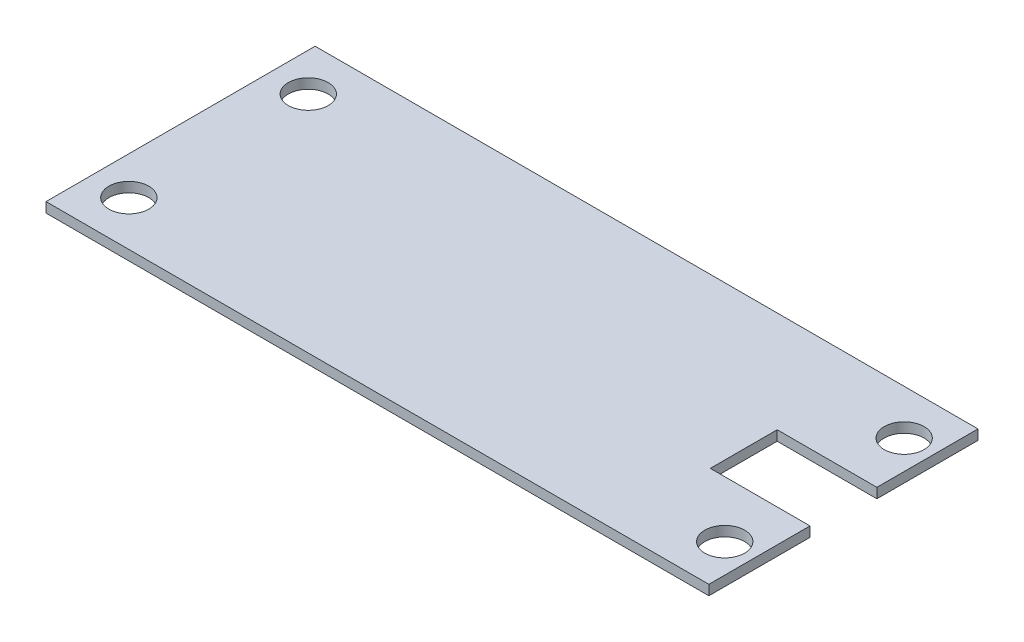
ISO-10303-21;
HEADER;
FILE_DESCRIPTION(('STEP AP214'),'2;1');
FILE_NAME('part.step','',(''),(''),'','','');
FILE_SCHEMA(('AUTOMOTIVE_DESIGN { 1 0 10303 214 1 1 1 1 }'));
ENDSEC;
DATA;
#1=APPLICATION_CONTEXT('core data for automotive mechanical design processes');
#2=APPLICATION_PROTOCOL_DEFINITION('international standard','automotive_design',2000,#1);
#3=PRODUCT_CONTEXT('',#1,'mechanical');
#4=PRODUCT('Part','Part','',(#3));
#5=PRODUCT_RELATED_PRODUCT_CATEGORY('part','',(#4));
#6=PRODUCT_DEFINITION_FORMATION('','',#4);
#7=PRODUCT_DEFINITION_CONTEXT('part definition',#1,'design');
#8=PRODUCT_DEFINITION('design','',#6,#7);
#9=PRODUCT_DEFINITION_SHAPE('','',#8);
#10=(LENGTH_UNIT() NAMED_UNIT(*) SI_UNIT(.MILLI.,.METRE.));
#11=(NAMED_UNIT(*) PLANE_ANGLE_UNIT() SI_UNIT($,.RADIAN.));
#12=(NAMED_UNIT(*) SI_UNIT($,.STERADIAN.) SOLID_ANGLE_UNIT());
#13=UNCERTAINTY_MEASURE_WITH_UNIT(LENGTH_MEASURE(1.E-05),#10,'distance_accuracy_value','');
#14=(GEOMETRIC_REPRESENTATION_CONTEXT(3) GLOBAL_UNCERTAINTY_ASSIGNED_CONTEXT((#13)) GLOBAL_UNIT_ASSIGNED_CONTEXT((#10,
#11,#12)) REPRESENTATION_CONTEXT('',''));
#15=CARTESIAN_POINT('',(0.,0.,0.));
#16=DIRECTION('',(0.,0.,1.));
#17=DIRECTION('',(1.,0.,0.));
#18=AXIS2_PLACEMENT_3D('',#15,#16,#17);
#19=CARTESIAN_POINT('',(66.5,1.,0.));
#20=DIRECTION('',(-1.,0.,0.));
#21=DIRECTION('',(0.,0.,1.));
#22=AXIS2_PLACEMENT_3D('',#19,#20,#21);
#23=PLANE('',#22);
#24=DIRECTION('',(0.,-1.,0.));
#25=VECTOR('',#24,1.);
#26=CARTESIAN_POINT('',(66.5,0.,-16.8538903517755));
#27=LINE('',#26,#25);
#28=CARTESIAN_POINT('',(66.5,1.,-16.8538903517755));
#29=VERTEX_POINT('',#28);
#30=CARTESIAN_POINT('',(66.5,0.,-16.8538903517755));
#31=VERTEX_POINT('',#30);
#32=EDGE_CURVE('E130',#29,#31,#27,.T.);
#33=ORIENTED_EDGE('',*,*,#32,.T.);
#34=DIRECTION('',(0.,0.,-1.));
#35=VECTOR('',#34,1.);
#36=CARTESIAN_POINT('',(66.5,0.,0.));
#37=LINE('',#36,#35);
#38=CARTESIAN_POINT('',(66.5,0.,-27.));
#39=VERTEX_POINT('',#38);
#40=EDGE_CURVE('E107',#31,#39,#37,.T.);
#41=ORIENTED_EDGE('',*,*,#40,.T.);
#42=DIRECTION('',(0.,-1.,0.));
#43=VECTOR('',#42,1.);
#44=CARTESIAN_POINT('',(66.5,1.,-27.));
#45=LINE('',#44,#43);
#46=CARTESIAN_POINT('',(66.5,1.,-27.));
#47=VERTEX_POINT('',#46);
#48=EDGE_CURVE('E159',#47,#39,#45,.T.);
#49=ORIENTED_EDGE('',*,*,#48,.F.);
#50=DIRECTION('',(0.,0.,-1.));
#51=VECTOR('',#50,1.);
#52=CARTESIAN_POINT('',(66.5,1.,0.));
#53=LINE('',#52,#51);
#54=EDGE_CURVE('E143',#29,#47,#53,.T.);
#55=ORIENTED_EDGE('',*,*,#54,.F.);
#56=EDGE_LOOP('',(#33,#41,#49,#55));
#57=FACE_BOUND('',#56,.T.);
#58=ADVANCED_FACE('F36',(#57),#23,.F.);
#59=DIRECTION('',(0.,1.,0.));
#60=VECTOR('',#59,1.);
#61=CARTESIAN_POINT('',(66.5,0.,-10.1461096482245));
#62=LINE('',#61,#60);
#63=CARTESIAN_POINT('',(66.5,0.,-10.1461096482245));
#64=VERTEX_POINT('',#63);
#65=CARTESIAN_POINT('',(66.5,1.,-10.1461096482245));
#66=VERTEX_POINT('',#65);
#67=EDGE_CURVE('E126',#64,#66,#62,.T.);
#68=ORIENTED_EDGE('',*,*,#67,.T.);
#69=CARTESIAN_POINT('',(66.5,1.,0.));
#70=VERTEX_POINT('',#69);
#71=EDGE_CURVE('E144',#70,#66,#53,.T.);
#72=ORIENTED_EDGE('',*,*,#71,.F.);
#73=DIRECTION('',(0.,-1.,0.));
#74=VECTOR('',#73,1.);
#75=CARTESIAN_POINT('',(66.5,1.,0.));
#76=LINE('',#75,#74);
#77=CARTESIAN_POINT('',(66.5,0.,0.));
#78=VERTEX_POINT('',#77);
#79=EDGE_CURVE('E44',#70,#78,#76,.T.);
#80=ORIENTED_EDGE('',*,*,#79,.T.);
#81=EDGE_CURVE('E153',#78,#64,#37,.T.);
#82=ORIENTED_EDGE('',*,*,#81,.T.);
#83=EDGE_LOOP('',(#68,#72,#80,#82));
#84=FACE_BOUND('',#83,.T.);
#85=ADVANCED_FACE('F166',(#84),#23,.F.);
#86=CARTESIAN_POINT('',(0.,1.,0.));
#87=DIRECTION('',(0.,-1.,0.));
#88=DIRECTION('',(0.,0.,-1.));
#89=AXIS2_PLACEMENT_3D('',#86,#87,#88);
#90=PLANE('',#89);
#91=CARTESIAN_POINT('',(3.81277709558755,1.,-4.5));
#92=DIRECTION('',(0.,1.,0.));
#93=DIRECTION('',(0.,0.,1.));
#94=AXIS2_PLACEMENT_3D('',#91,#92,#93);
#95=CIRCLE('',#94,2.);
#96=CARTESIAN_POINT('',(3.81277709558755,1.,-2.5));
#97=VERTEX_POINT('',#96);
#98=EDGE_CURVE('E250',#97,#97,#95,.T.);
#99=ORIENTED_EDGE('',*,*,#98,.F.);
#100=EDGE_LOOP('',(#99));
#101=FACE_BOUND('',#100,.T.);
#102=CARTESIAN_POINT('',(3.81277709558755,1.,-22.5));
#103=DIRECTION('',(0.,1.,0.));
#104=DIRECTION('',(0.,0.,1.));
#105=AXIS2_PLACEMENT_3D('',#102,#103,#104);
#106=CIRCLE('',#105,2.);
#107=CARTESIAN_POINT('',(3.81277709558755,1.,-20.5));
#108=VERTEX_POINT('',#107);
#109=EDGE_CURVE('E243',#108,#108,#106,.T.);
#110=ORIENTED_EDGE('',*,*,#109,.F.);
#111=EDGE_LOOP('',(#110));
#112=FACE_BOUND('',#111,.T.);
#113=CARTESIAN_POINT('',(63.5912451049318,1.,-22.5));
#114=DIRECTION('',(0.,1.,0.));
#115=DIRECTION('',(0.,0.,1.));
#116=AXIS2_PLACEMENT_3D('',#113,#114,#115);
#117=CIRCLE('',#116,2.);
#118=CARTESIAN_POINT('',(63.5912451049318,1.,-20.5));
#119=VERTEX_POINT('',#118);
#120=EDGE_CURVE('E236',#119,#119,#117,.T.);
#121=ORIENTED_EDGE('',*,*,#120,.F.);
#122=EDGE_LOOP('',(#121));
#123=FACE_BOUND('',#122,.T.);
#124=CARTESIAN_POINT('',(63.5912451049318,1.,-4.5));
#125=DIRECTION('',(0.,1.,0.));
#126=DIRECTION('',(0.,0.,1.));
#127=AXIS2_PLACEMENT_3D('',#124,#125,#126);
#128=CIRCLE('',#127,2.);
#129=CARTESIAN_POINT('',(63.5912451049318,1.,-2.5));
#130=VERTEX_POINT('',#129);
#131=EDGE_CURVE('E240',#130,#130,#128,.T.);
#132=ORIENTED_EDGE('',*,*,#131,.F.);
#133=EDGE_LOOP('',(#132));
#134=FACE_BOUND('',#133,.T.);
#135=DIRECTION('',(-1.,0.,0.));
#136=VECTOR('',#135,1.);
#137=CARTESIAN_POINT('',(0.,1.,-16.8538903517755));
#138=LINE('',#137,#136);
#139=CARTESIAN_POINT('',(56.5,1.,-16.8538903517755));
#140=VERTEX_POINT('',#139);
#141=EDGE_CURVE('E123',#29,#140,#138,.T.);
#142=ORIENTED_EDGE('',*,*,#141,.F.);
#143=ORIENTED_EDGE('',*,*,#54,.T.);
#144=DIRECTION('',(-1.,0.,0.));
#145=VECTOR('',#144,1.);
#146=CARTESIAN_POINT('',(0.,1.,-27.));
#147=LINE('',#146,#145);
#148=CARTESIAN_POINT('',(0.,1.,-27.));
#149=VERTEX_POINT('',#148);
#150=EDGE_CURVE('E146',#47,#149,#147,.T.);
#151=ORIENTED_EDGE('',*,*,#150,.T.);
#152=DIRECTION('',(0.,0.,1.));
#153=VECTOR('',#152,1.);
#154=CARTESIAN_POINT('',(0.,1.,0.));
#155=LINE('',#154,#153);
#156=CARTESIAN_POINT('',(0.,1.,0.));
#157=VERTEX_POINT('',#156);
#158=EDGE_CURVE('E137',#149,#157,#155,.T.);
#159=ORIENTED_EDGE('',*,*,#158,.T.);
#160=DIRECTION('',(1.,0.,0.));
#161=VECTOR('',#160,1.);
#162=CARTESIAN_POINT('',(0.,1.,0.));
#163=LINE('',#162,#161);
#164=EDGE_CURVE('E140',#157,#70,#163,.T.);
#165=ORIENTED_EDGE('',*,*,#164,.T.);
#166=ORIENTED_EDGE('',*,*,#71,.T.);
#167=DIRECTION('',(1.,0.,0.));
#168=VECTOR('',#167,1.);
#169=CARTESIAN_POINT('',(0.,1.,-10.1461096482245));
#170=LINE('',#169,#168);
#171=CARTESIAN_POINT('',(56.5,1.,-10.1461096482245));
#172=VERTEX_POINT('',#171);
#173=EDGE_CURVE('E56',#172,#66,#170,.T.);
#174=ORIENTED_EDGE('',*,*,#173,.F.);
#175=DIRECTION('',(0.,0.,-1.));
#176=VECTOR('',#175,1.);
#177=CARTESIAN_POINT('',(56.5,1.,0.));
#178=LINE('',#177,#176);
#179=EDGE_CURVE('E51',#172,#140,#178,.T.);
#180=ORIENTED_EDGE('',*,*,#179,.T.);
#181=EDGE_LOOP('',(#142,#143,#151,#159,#165,#166,#174,#180));
#182=FACE_BOUND('',#181,.T.);
#183=ADVANCED_FACE('F171',(#101,#112,#123,#134,#182),#90,.F.);
#184=CARTESIAN_POINT('',(0.,0.,0.));
#185=DIRECTION('',(0.,-1.,0.));
#186=DIRECTION('',(0.,0.,-1.));
#187=AXIS2_PLACEMENT_3D('',#184,#185,#186);
#188=PLANE('',#187);
#189=CARTESIAN_POINT('',(3.81277709558755,0.,-4.5));
#190=DIRECTION('',(0.,1.,0.));
#191=DIRECTION('',(0.,0.,1.));
#192=AXIS2_PLACEMENT_3D('',#189,#190,#191);
#193=CIRCLE('',#192,2.);
#194=CARTESIAN_POINT('',(3.81277709558755,0.,-2.5));
#195=VERTEX_POINT('',#194);
#196=EDGE_CURVE('E248',#195,#195,#193,.T.);
#197=ORIENTED_EDGE('',*,*,#196,.T.);
#198=EDGE_LOOP('',(#197));
#199=FACE_BOUND('',#198,.T.);
#200=CARTESIAN_POINT('',(3.81277709558755,0.,-22.5));
#201=DIRECTION('',(0.,1.,0.));
#202=DIRECTION('',(0.,0.,1.));
#203=AXIS2_PLACEMENT_3D('',#200,#201,#202);
#204=CIRCLE('',#203,2.);
#205=CARTESIAN_POINT('',(3.81277709558755,0.,-20.5));
#206=VERTEX_POINT('',#205);
#207=EDGE_CURVE('E238',#206,#206,#204,.T.);
#208=ORIENTED_EDGE('',*,*,#207,.T.);
#209=EDGE_LOOP('',(#208));
#210=FACE_BOUND('',#209,.T.);
#211=CARTESIAN_POINT('',(63.5912451049318,0.,-22.5));
#212=DIRECTION('',(0.,1.,0.));
#213=DIRECTION('',(0.,0.,1.));
#214=AXIS2_PLACEMENT_3D('',#211,#212,#213);
#215=CIRCLE('',#214,2.);
#216=CARTESIAN_POINT('',(63.5912451049318,0.,-20.5));
#217=VERTEX_POINT('',#216);
#218=EDGE_CURVE('E233',#217,#217,#215,.T.);
#219=ORIENTED_EDGE('',*,*,#218,.T.);
#220=EDGE_LOOP('',(#219));
#221=FACE_BOUND('',#220,.T.);
#222=CARTESIAN_POINT('',(63.5912451049318,0.,-4.5));
#223=DIRECTION('',(0.,1.,0.));
#224=DIRECTION('',(0.,0.,1.));
#225=AXIS2_PLACEMENT_3D('',#222,#223,#224);
#226=CIRCLE('',#225,2.);
#227=CARTESIAN_POINT('',(63.5912451049318,0.,-2.5));
#228=VERTEX_POINT('',#227);
#229=EDGE_CURVE('E120',#228,#228,#226,.T.);
#230=ORIENTED_EDGE('',*,*,#229,.T.);
#231=EDGE_LOOP('',(#230));
#232=FACE_BOUND('',#231,.T.);
#233=DIRECTION('',(0.,0.,1.));
#234=VECTOR('',#233,1.);
#235=CARTESIAN_POINT('',(0.,0.,0.));
#236=LINE('',#235,#234);
#237=CARTESIAN_POINT('',(0.,0.,-27.));
#238=VERTEX_POINT('',#237);
#239=CARTESIAN_POINT('',(0.,0.,0.));
#240=VERTEX_POINT('',#239);
#241=EDGE_CURVE('E136',#238,#240,#236,.T.);
#242=ORIENTED_EDGE('',*,*,#241,.F.);
#243=DIRECTION('',(-1.,0.,0.));
#244=VECTOR('',#243,1.);
#245=CARTESIAN_POINT('',(0.,0.,-27.));
#246=LINE('',#245,#244);
#247=EDGE_CURVE('E141',#39,#238,#246,.T.);
#248=ORIENTED_EDGE('',*,*,#247,.F.);
#249=ORIENTED_EDGE('',*,*,#40,.F.);
#250=DIRECTION('',(-1.,0.,0.));
#251=VECTOR('',#250,1.);
#252=CARTESIAN_POINT('',(239.348969066242,0.,-16.8538903517755));
#253=LINE('',#252,#251);
#254=CARTESIAN_POINT('',(56.5,0.,-16.8538903517755));
#255=VERTEX_POINT('',#254);
#256=EDGE_CURVE('E100',#31,#255,#253,.T.);
#257=ORIENTED_EDGE('',*,*,#256,.T.);
#258=DIRECTION('',(0.,0.,-1.));
#259=VECTOR('',#258,1.);
#260=CARTESIAN_POINT('',(56.5,0.,0.));
#261=LINE('',#260,#259);
#262=CARTESIAN_POINT('',(56.5,0.,-10.1461096482245));
#263=VERTEX_POINT('',#262);
#264=EDGE_CURVE('E104',#263,#255,#261,.T.);
#265=ORIENTED_EDGE('',*,*,#264,.F.);
#266=DIRECTION('',(-1.,0.,0.));
#267=VECTOR('',#266,1.);
#268=CARTESIAN_POINT('',(239.348969066242,0.,-10.1461096482245));
#269=LINE('',#268,#267);
#270=EDGE_CURVE('E111',#64,#263,#269,.T.);
#271=ORIENTED_EDGE('',*,*,#270,.F.);
#272=ORIENTED_EDGE('',*,*,#81,.F.);
#273=DIRECTION('',(1.,0.,0.));
#274=VECTOR('',#273,1.);
#275=CARTESIAN_POINT('',(0.,0.,0.));
#276=LINE('',#275,#274);
#277=EDGE_CURVE('E151',#240,#78,#276,.T.);
#278=ORIENTED_EDGE('',*,*,#277,.F.);
#279=EDGE_LOOP('',(#242,#248,#249,#257,#265,#271,#272,#278));
#280=FACE_BOUND('',#279,.T.);
#281=ADVANCED_FACE('F103',(#199,#210,#221,#232,#280),#188,.T.);
#282=CARTESIAN_POINT('',(0.,1.,0.));
#283=DIRECTION('',(1.,0.,0.));
#284=DIRECTION('',(0.,0.,-1.));
#285=AXIS2_PLACEMENT_3D('',#282,#283,#284);
#286=PLANE('',#285);
#287=ORIENTED_EDGE('',*,*,#241,.T.);
#288=DIRECTION('',(0.,-1.,0.));
#289=VECTOR('',#288,1.);
#290=CARTESIAN_POINT('',(0.,1.,0.));
#291=LINE('',#290,#289);
#292=EDGE_CURVE('E11',#157,#240,#291,.T.);
#293=ORIENTED_EDGE('',*,*,#292,.F.);
#294=ORIENTED_EDGE('',*,*,#158,.F.);
#295=DIRECTION('',(0.,-1.,0.));
#296=VECTOR('',#295,1.);
#297=CARTESIAN_POINT('',(0.,1.,-27.));
#298=LINE('',#297,#296);
#299=EDGE_CURVE('E148',#149,#238,#298,.T.);
#300=ORIENTED_EDGE('',*,*,#299,.T.);
#301=EDGE_LOOP('',(#287,#293,#294,#300));
#302=FACE_BOUND('',#301,.T.);
#303=ADVANCED_FACE('F38',(#302),#286,.F.);
#304=CARTESIAN_POINT('',(0.,1.,0.));
#305=DIRECTION('',(0.,0.,-1.));
#306=DIRECTION('',(-1.,0.,0.));
#307=AXIS2_PLACEMENT_3D('',#304,#305,#306);
#308=PLANE('',#307);
#309=ORIENTED_EDGE('',*,*,#277,.T.);
#310=ORIENTED_EDGE('',*,*,#79,.F.);
#311=ORIENTED_EDGE('',*,*,#164,.F.);
#312=ORIENTED_EDGE('',*,*,#292,.T.);
#313=EDGE_LOOP('',(#309,#310,#311,#312));
#314=FACE_BOUND('',#313,.T.);
#315=ADVANCED_FACE('F174',(#314),#308,.F.);
#316=CARTESIAN_POINT('',(0.,1.,-27.));
#317=DIRECTION('',(0.,0.,1.));
#318=DIRECTION('',(1.,0.,0.));
#319=AXIS2_PLACEMENT_3D('',#316,#317,#318);
#320=PLANE('',#319);
#321=ORIENTED_EDGE('',*,*,#247,.T.);
#322=ORIENTED_EDGE('',*,*,#299,.F.);
#323=ORIENTED_EDGE('',*,*,#150,.F.);
#324=ORIENTED_EDGE('',*,*,#48,.T.);
#325=EDGE_LOOP('',(#321,#322,#323,#324));
#326=FACE_BOUND('',#325,.T.);
#327=ADVANCED_FACE('F178',(#326),#320,.F.);
#328=CARTESIAN_POINT('',(239.348969066242,0.,-16.8538903517755));
#329=DIRECTION('',(0.,0.,1.));
#330=DIRECTION('',(1.,0.,0.));
#331=AXIS2_PLACEMENT_3D('',#328,#329,#330);
#332=PLANE('',#331);
#333=ORIENTED_EDGE('',*,*,#32,.F.);
#334=ORIENTED_EDGE('',*,*,#141,.T.);
#335=DIRECTION('',(0.,-1.,0.));
#336=VECTOR('',#335,1.);
#337=CARTESIAN_POINT('',(56.5,0.,-16.8538903517755));
#338=LINE('',#337,#336);
#339=EDGE_CURVE('E116',#140,#255,#338,.T.);
#340=ORIENTED_EDGE('',*,*,#339,.T.);
#341=ORIENTED_EDGE('',*,*,#256,.F.);
#342=EDGE_LOOP('',(#333,#334,#340,#341));
#343=FACE_BOUND('',#342,.T.);
#344=ADVANCED_FACE('F122',(#343),#332,.T.);
#345=CARTESIAN_POINT('',(239.348969066242,0.,-10.1461096482245));
#346=DIRECTION('',(0.,0.,-1.));
#347=DIRECTION('',(-1.,0.,0.));
#348=AXIS2_PLACEMENT_3D('',#345,#346,#347);
#349=PLANE('',#348);
#350=DIRECTION('',(0.,1.,0.));
#351=VECTOR('',#350,1.);
#352=CARTESIAN_POINT('',(56.5,0.,-10.1461096482245));
#353=LINE('',#352,#351);
#354=EDGE_CURVE('E118',#263,#172,#353,.T.);
#355=ORIENTED_EDGE('',*,*,#354,.T.);
#356=ORIENTED_EDGE('',*,*,#173,.T.);
#357=ORIENTED_EDGE('',*,*,#67,.F.);
#358=ORIENTED_EDGE('',*,*,#270,.T.);
#359=EDGE_LOOP('',(#355,#356,#357,#358));
#360=FACE_BOUND('',#359,.T.);
#361=ADVANCED_FACE('F170',(#360),#349,.T.);
#362=CARTESIAN_POINT('',(56.5,1.,0.));
#363=DIRECTION('',(-1.,0.,0.));
#364=DIRECTION('',(0.,0.,1.));
#365=AXIS2_PLACEMENT_3D('',#362,#363,#364);
#366=PLANE('',#365);
#367=ORIENTED_EDGE('',*,*,#179,.F.);
#368=ORIENTED_EDGE('',*,*,#354,.F.);
#369=ORIENTED_EDGE('',*,*,#264,.T.);
#370=ORIENTED_EDGE('',*,*,#339,.F.);
#371=EDGE_LOOP('',(#367,#368,#369,#370));
#372=FACE_BOUND('',#371,.T.);
#373=ADVANCED_FACE('F115',(#372),#366,.F.);
#374=CARTESIAN_POINT('',(63.5912451049318,0.,-4.5));
#375=DIRECTION('',(0.,1.,0.));
#376=DIRECTION('',(0.,0.,1.));
#377=AXIS2_PLACEMENT_3D('',#374,#375,#376);
#378=CYLINDRICAL_SURFACE('',#377,2.);
#379=ORIENTED_EDGE('',*,*,#229,.F.);
#380=EDGE_LOOP('',(#379));
#381=FACE_BOUND('',#380,.T.);
#382=ORIENTED_EDGE('',*,*,#131,.T.);
#383=EDGE_LOOP('',(#382));
#384=FACE_BOUND('',#383,.T.);
#385=ADVANCED_FACE('F209',(#381,#384),#378,.F.);
#386=CARTESIAN_POINT('',(63.5912451049318,0.,-22.5));
#387=DIRECTION('',(0.,1.,0.));
#388=DIRECTION('',(0.,0.,1.));
#389=AXIS2_PLACEMENT_3D('',#386,#387,#388);
#390=CYLINDRICAL_SURFACE('',#389,2.);
#391=ORIENTED_EDGE('',*,*,#218,.F.);
#392=EDGE_LOOP('',(#391));
#393=FACE_BOUND('',#392,.T.);
#394=ORIENTED_EDGE('',*,*,#120,.T.);
#395=EDGE_LOOP('',(#394));
#396=FACE_BOUND('',#395,.T.);
#397=ADVANCED_FACE('F216',(#393,#396),#390,.F.);
#398=CARTESIAN_POINT('',(3.81277709558755,0.,-22.5));
#399=DIRECTION('',(0.,1.,0.));
#400=DIRECTION('',(0.,0.,1.));
#401=AXIS2_PLACEMENT_3D('',#398,#399,#400);
#402=CYLINDRICAL_SURFACE('',#401,2.);
#403=ORIENTED_EDGE('',*,*,#207,.F.);
#404=EDGE_LOOP('',(#403));
#405=FACE_BOUND('',#404,.T.);
#406=ORIENTED_EDGE('',*,*,#109,.T.);
#407=EDGE_LOOP('',(#406));
#408=FACE_BOUND('',#407,.T.);
#409=ADVANCED_FACE('F221',(#405,#408),#402,.F.);
#410=CARTESIAN_POINT('',(3.81277709558755,0.,-4.5));
#411=DIRECTION('',(0.,1.,0.));
#412=DIRECTION('',(0.,0.,1.));
#413=AXIS2_PLACEMENT_3D('',#410,#411,#412);
#414=CYLINDRICAL_SURFACE('',#413,2.);
#415=ORIENTED_EDGE('',*,*,#196,.F.);
#416=EDGE_LOOP('',(#415));
#417=FACE_BOUND('',#416,.T.);
#418=ORIENTED_EDGE('',*,*,#98,.T.);
#419=EDGE_LOOP('',(#418));
#420=FACE_BOUND('',#419,.T.);
#421=ADVANCED_FACE('F218',(#417,#420),#414,.F.);
#422=CLOSED_SHELL('',(#58,#85,#183,#281,#303,#315,#327,#344,#361,#373,#385,#397,#409,#421));
#423=MANIFOLD_SOLID_BREP('B2',#422);
#424=ADVANCED_BREP_SHAPE_REPRESENTATION('',(#18,#423),#14);
#425=SHAPE_DEFINITION_REPRESENTATION(#9,#424);
ENDSEC;
END-ISO-10303-21;
